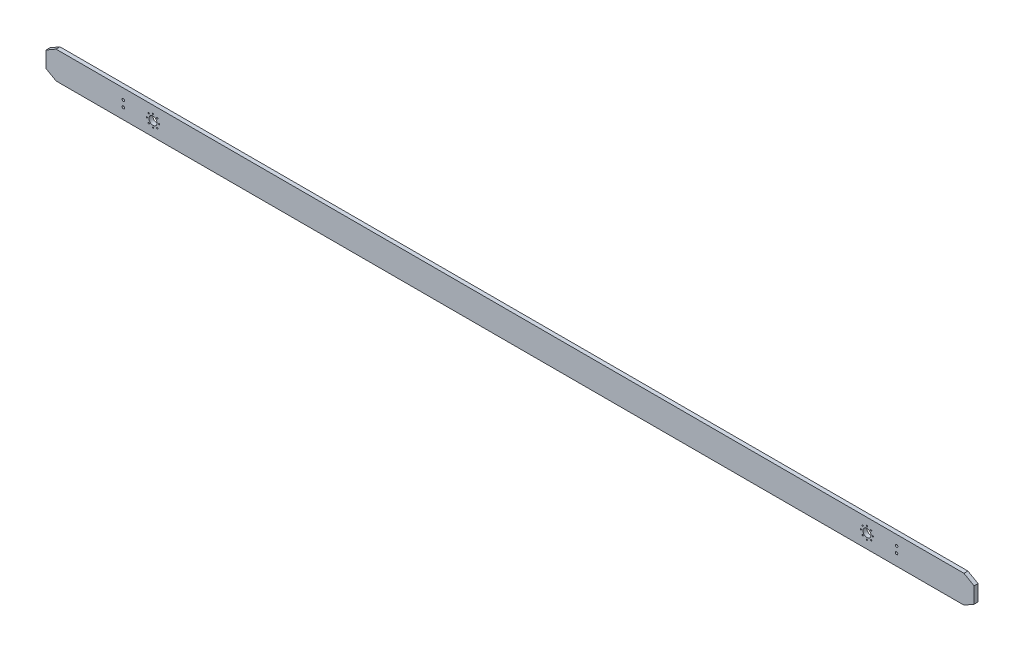
ISO-10303-21;
HEADER;
FILE_DESCRIPTION(('STEP AP214'),'2;1');
FILE_NAME('part.step','',(''),(''),'','','');
FILE_SCHEMA(('AUTOMOTIVE_DESIGN { 1 0 10303 214 1 1 1 1 }'));
ENDSEC;
DATA;
#1=APPLICATION_CONTEXT('core data for automotive mechanical design processes');
#2=APPLICATION_PROTOCOL_DEFINITION('international standard','automotive_design',2000,#1);
#3=PRODUCT_CONTEXT('',#1,'mechanical');
#4=PRODUCT('Part','Part','',(#3));
#5=PRODUCT_RELATED_PRODUCT_CATEGORY('part','',(#4));
#6=PRODUCT_DEFINITION_FORMATION('','',#4);
#7=PRODUCT_DEFINITION_CONTEXT('part definition',#1,'design');
#8=PRODUCT_DEFINITION('design','',#6,#7);
#9=PRODUCT_DEFINITION_SHAPE('','',#8);
#10=(LENGTH_UNIT() NAMED_UNIT(*) SI_UNIT(.MILLI.,.METRE.));
#11=(NAMED_UNIT(*) PLANE_ANGLE_UNIT() SI_UNIT($,.RADIAN.));
#12=(NAMED_UNIT(*) SI_UNIT($,.STERADIAN.) SOLID_ANGLE_UNIT());
#13=UNCERTAINTY_MEASURE_WITH_UNIT(LENGTH_MEASURE(1.E-05),#10,'distance_accuracy_value','');
#14=(GEOMETRIC_REPRESENTATION_CONTEXT(3) GLOBAL_UNCERTAINTY_ASSIGNED_CONTEXT((#13)) GLOBAL_UNIT_ASSIGNED_CONTEXT((#10,
#11,#12)) REPRESENTATION_CONTEXT('',''));
#15=CARTESIAN_POINT('',(0.,0.,0.));
#16=DIRECTION('',(0.,0.,1.));
#17=DIRECTION('',(1.,0.,0.));
#18=AXIS2_PLACEMENT_3D('',#15,#16,#17);
#19=CARTESIAN_POINT('',(55.650662,-30.499967,-0.79));
#20=DIRECTION('',(0.,0.,1.));
#21=DIRECTION('',(1.,0.,0.));
#22=AXIS2_PLACEMENT_3D('',#19,#20,#21);
#23=CYLINDRICAL_SURFACE('',#22,0.25);
#24=DIRECTION('',(0.,0.,1.));
#25=VECTOR('',#24,1.);
#26=CARTESIAN_POINT('',(55.900662,-30.499967,-0.79));
#27=LINE('',#26,#25);
#28=CARTESIAN_POINT('',(55.900662,-30.499967,0.));
#29=VERTEX_POINT('',#28);
#30=CARTESIAN_POINT('',(55.900662,-30.499967,1.58));
#31=VERTEX_POINT('',#30);
#32=EDGE_CURVE('E10',#29,#31,#27,.T.);
#33=ORIENTED_EDGE('',*,*,#32,.F.);
#34=CARTESIAN_POINT('',(55.650662,-30.499967,0.));
#35=DIRECTION('',(0.,0.,1.));
#36=DIRECTION('',(1.,0.,0.));
#37=AXIS2_PLACEMENT_3D('',#34,#35,#36);
#38=CIRCLE('',#37,0.25);
#39=EDGE_CURVE('E290',#29,#29,#38,.T.);
#40=ORIENTED_EDGE('',*,*,#39,.F.);
#41=ORIENTED_EDGE('',*,*,#32,.T.);
#42=CARTESIAN_POINT('',(55.650662,-30.499967,1.58));
#43=DIRECTION('',(0.,0.,1.));
#44=DIRECTION('',(1.,0.,0.));
#45=AXIS2_PLACEMENT_3D('',#42,#43,#44);
#46=CIRCLE('',#45,0.25);
#47=EDGE_CURVE('E371',#31,#31,#46,.T.);
#48=ORIENTED_EDGE('',*,*,#47,.T.);
#49=EDGE_LOOP('',(#33,#40,#41,#48));
#50=FACE_BOUND('',#49,.T.);
#51=ADVANCED_FACE('F16',(#50),#23,.F.);
#52=CARTESIAN_POINT('',(53.953606,-31.202911,-0.79));
#53=DIRECTION('',(0.,0.,1.));
#54=DIRECTION('',(1.,0.,0.));
#55=AXIS2_PLACEMENT_3D('',#52,#53,#54);
#56=CYLINDRICAL_SURFACE('',#55,0.25);
#57=DIRECTION('',(0.,0.,1.));
#58=VECTOR('',#57,1.);
#59=CARTESIAN_POINT('',(54.203606,-31.202911,-0.79));
#60=LINE('',#59,#58);
#61=CARTESIAN_POINT('',(54.203606,-31.202911,0.));
#62=VERTEX_POINT('',#61);
#63=CARTESIAN_POINT('',(54.203606,-31.202911,1.58));
#64=VERTEX_POINT('',#63);
#65=EDGE_CURVE('E27',#62,#64,#60,.T.);
#66=ORIENTED_EDGE('',*,*,#65,.F.);
#67=CARTESIAN_POINT('',(53.953606,-31.202911,0.));
#68=DIRECTION('',(0.,0.,1.));
#69=DIRECTION('',(1.,0.,0.));
#70=AXIS2_PLACEMENT_3D('',#67,#68,#69);
#71=CIRCLE('',#70,0.25);
#72=EDGE_CURVE('E289',#62,#62,#71,.T.);
#73=ORIENTED_EDGE('',*,*,#72,.F.);
#74=ORIENTED_EDGE('',*,*,#65,.T.);
#75=CARTESIAN_POINT('',(53.953606,-31.202911,1.58));
#76=DIRECTION('',(0.,0.,1.));
#77=DIRECTION('',(1.,0.,0.));
#78=AXIS2_PLACEMENT_3D('',#75,#76,#77);
#79=CIRCLE('',#78,0.25);
#80=EDGE_CURVE('E369',#64,#64,#79,.T.);
#81=ORIENTED_EDGE('',*,*,#80,.T.);
#82=EDGE_LOOP('',(#66,#73,#74,#81));
#83=FACE_BOUND('',#82,.T.);
#84=ADVANCED_FACE('F18',(#83),#56,.F.);
#85=CARTESIAN_POINT('',(57.347718,-31.202911,-0.79));
#86=DIRECTION('',(0.,0.,1.));
#87=DIRECTION('',(1.,0.,0.));
#88=AXIS2_PLACEMENT_3D('',#85,#86,#87);
#89=CYLINDRICAL_SURFACE('',#88,0.25);
#90=DIRECTION('',(0.,0.,1.));
#91=VECTOR('',#90,1.);
#92=CARTESIAN_POINT('',(57.597718,-31.202911,-0.79));
#93=LINE('',#92,#91);
#94=CARTESIAN_POINT('',(57.597718,-31.202911,0.));
#95=VERTEX_POINT('',#94);
#96=CARTESIAN_POINT('',(57.597718,-31.202911,1.58));
#97=VERTEX_POINT('',#96);
#98=EDGE_CURVE('E220',#95,#97,#93,.T.);
#99=ORIENTED_EDGE('',*,*,#98,.F.);
#100=CARTESIAN_POINT('',(57.347718,-31.202911,0.));
#101=DIRECTION('',(0.,0.,1.));
#102=DIRECTION('',(1.,0.,0.));
#103=AXIS2_PLACEMENT_3D('',#100,#101,#102);
#104=CIRCLE('',#103,0.25);
#105=EDGE_CURVE('E225',#95,#95,#104,.T.);
#106=ORIENTED_EDGE('',*,*,#105,.F.);
#107=ORIENTED_EDGE('',*,*,#98,.T.);
#108=CARTESIAN_POINT('',(57.347718,-31.202911,1.58));
#109=DIRECTION('',(0.,0.,1.));
#110=DIRECTION('',(1.,0.,0.));
#111=AXIS2_PLACEMENT_3D('',#108,#109,#110);
#112=CIRCLE('',#111,0.25);
#113=EDGE_CURVE('E223',#97,#97,#112,.T.);
#114=ORIENTED_EDGE('',*,*,#113,.T.);
#115=EDGE_LOOP('',(#99,#106,#107,#114));
#116=FACE_BOUND('',#115,.T.);
#117=ADVANCED_FACE('F221',(#116),#89,.F.);
#118=CARTESIAN_POINT('',(43.849802,-31.649967,-0.79));
#119=DIRECTION('',(0.,0.,1.));
#120=DIRECTION('',(1.,0.,0.));
#121=AXIS2_PLACEMENT_3D('',#118,#119,#120);
#122=CYLINDRICAL_SURFACE('',#121,0.5);
#123=DIRECTION('',(0.,0.,1.));
#124=VECTOR('',#123,1.);
#125=CARTESIAN_POINT('',(44.349802,-31.649967,-0.79));
#126=LINE('',#125,#124);
#127=CARTESIAN_POINT('',(44.349802,-31.649967,0.));
#128=VERTEX_POINT('',#127);
#129=CARTESIAN_POINT('',(44.349802,-31.649967,1.58));
#130=VERTEX_POINT('',#129);
#131=EDGE_CURVE('E20',#128,#130,#126,.T.);
#132=ORIENTED_EDGE('',*,*,#131,.F.);
#133=CARTESIAN_POINT('',(43.849802,-31.649967,0.));
#134=DIRECTION('',(0.,0.,1.));
#135=DIRECTION('',(1.,0.,0.));
#136=AXIS2_PLACEMENT_3D('',#133,#134,#135);
#137=CIRCLE('',#136,0.5);
#138=EDGE_CURVE('E283',#128,#128,#137,.T.);
#139=ORIENTED_EDGE('',*,*,#138,.F.);
#140=ORIENTED_EDGE('',*,*,#131,.T.);
#141=CARTESIAN_POINT('',(43.849802,-31.649967,1.58));
#142=DIRECTION('',(0.,0.,1.));
#143=DIRECTION('',(1.,0.,0.));
#144=AXIS2_PLACEMENT_3D('',#141,#142,#143);
#145=CIRCLE('',#144,0.5);
#146=EDGE_CURVE('E370',#130,#130,#145,.T.);
#147=ORIENTED_EDGE('',*,*,#146,.T.);
#148=EDGE_LOOP('',(#132,#139,#140,#147));
#149=FACE_BOUND('',#148,.T.);
#150=ADVANCED_FACE('F765',(#149),#122,.F.);
#151=CARTESIAN_POINT('',(53.250662,-32.899967,-0.79));
#152=DIRECTION('',(0.,0.,1.));
#153=DIRECTION('',(1.,0.,0.));
#154=AXIS2_PLACEMENT_3D('',#151,#152,#153);
#155=CYLINDRICAL_SURFACE('',#154,0.25);
#156=DIRECTION('',(0.,0.,1.));
#157=VECTOR('',#156,1.);
#158=CARTESIAN_POINT('',(53.500662,-32.899967,-0.79));
#159=LINE('',#158,#157);
#160=CARTESIAN_POINT('',(53.500662,-32.899967,0.));
#161=VERTEX_POINT('',#160);
#162=CARTESIAN_POINT('',(53.500662,-32.899967,1.58));
#163=VERTEX_POINT('',#162);
#164=EDGE_CURVE('E233',#161,#163,#159,.T.);
#165=ORIENTED_EDGE('',*,*,#164,.F.);
#166=CARTESIAN_POINT('',(53.250662,-32.899967,0.));
#167=DIRECTION('',(0.,0.,1.));
#168=DIRECTION('',(1.,0.,0.));
#169=AXIS2_PLACEMENT_3D('',#166,#167,#168);
#170=CIRCLE('',#169,0.25);
#171=EDGE_CURVE('E282',#161,#161,#170,.T.);
#172=ORIENTED_EDGE('',*,*,#171,.F.);
#173=ORIENTED_EDGE('',*,*,#164,.T.);
#174=CARTESIAN_POINT('',(53.250662,-32.899967,1.58));
#175=DIRECTION('',(0.,0.,1.));
#176=DIRECTION('',(1.,0.,0.));
#177=AXIS2_PLACEMENT_3D('',#174,#175,#176);
#178=CIRCLE('',#177,0.25);
#179=EDGE_CURVE('E365',#163,#163,#178,.T.);
#180=ORIENTED_EDGE('',*,*,#179,.T.);
#181=EDGE_LOOP('',(#165,#172,#173,#180));
#182=FACE_BOUND('',#181,.T.);
#183=ADVANCED_FACE('F771',(#182),#155,.F.);
#184=CARTESIAN_POINT('',(55.650662,-32.899967,-0.79));
#185=DIRECTION('',(0.,0.,1.));
#186=DIRECTION('',(1.,0.,0.));
#187=AXIS2_PLACEMENT_3D('',#184,#185,#186);
#188=CYLINDRICAL_SURFACE('',#187,1.6);
#189=DIRECTION('',(0.,0.,1.));
#190=VECTOR('',#189,1.);
#191=CARTESIAN_POINT('',(57.250662,-32.899967,-0.79));
#192=LINE('',#191,#190);
#193=CARTESIAN_POINT('',(57.250662,-32.899967,0.));
#194=VERTEX_POINT('',#193);
#195=CARTESIAN_POINT('',(57.250662,-32.899967,1.58));
#196=VERTEX_POINT('',#195);
#197=EDGE_CURVE('E414',#194,#196,#192,.T.);
#198=ORIENTED_EDGE('',*,*,#197,.F.);
#199=CARTESIAN_POINT('',(55.650662,-32.899967,0.));
#200=DIRECTION('',(0.,0.,1.));
#201=DIRECTION('',(1.,0.,0.));
#202=AXIS2_PLACEMENT_3D('',#199,#200,#201);
#203=CIRCLE('',#202,1.6);
#204=EDGE_CURVE('E266',#194,#194,#203,.T.);
#205=ORIENTED_EDGE('',*,*,#204,.F.);
#206=ORIENTED_EDGE('',*,*,#197,.T.);
#207=CARTESIAN_POINT('',(55.650662,-32.899967,1.58));
#208=DIRECTION('',(0.,0.,1.));
#209=DIRECTION('',(1.,0.,0.));
#210=AXIS2_PLACEMENT_3D('',#207,#208,#209);
#211=CIRCLE('',#210,1.6);
#212=EDGE_CURVE('E361',#196,#196,#211,.T.);
#213=ORIENTED_EDGE('',*,*,#212,.T.);
#214=EDGE_LOOP('',(#198,#205,#206,#213));
#215=FACE_BOUND('',#214,.T.);
#216=ADVANCED_FACE('F779',(#215),#188,.F.);
#217=CARTESIAN_POINT('',(58.050662,-32.899967,-0.79));
#218=DIRECTION('',(0.,0.,1.));
#219=DIRECTION('',(1.,0.,0.));
#220=AXIS2_PLACEMENT_3D('',#217,#218,#219);
#221=CYLINDRICAL_SURFACE('',#220,0.25);
#222=DIRECTION('',(0.,0.,1.));
#223=VECTOR('',#222,1.);
#224=CARTESIAN_POINT('',(58.300662,-32.899967,-0.79));
#225=LINE('',#224,#223);
#226=CARTESIAN_POINT('',(58.300662,-32.899967,0.));
#227=VERTEX_POINT('',#226);
#228=CARTESIAN_POINT('',(58.300662,-32.899967,1.58));
#229=VERTEX_POINT('',#228);
#230=EDGE_CURVE('E256',#227,#229,#225,.T.);
#231=ORIENTED_EDGE('',*,*,#230,.F.);
#232=CARTESIAN_POINT('',(58.050662,-32.899967,0.));
#233=DIRECTION('',(0.,0.,1.));
#234=DIRECTION('',(1.,0.,0.));
#235=AXIS2_PLACEMENT_3D('',#232,#233,#234);
#236=CIRCLE('',#235,0.25);
#237=EDGE_CURVE('E262',#227,#227,#236,.T.);
#238=ORIENTED_EDGE('',*,*,#237,.F.);
#239=ORIENTED_EDGE('',*,*,#230,.T.);
#240=CARTESIAN_POINT('',(58.050662,-32.899967,1.58));
#241=DIRECTION('',(0.,0.,1.));
#242=DIRECTION('',(1.,0.,0.));
#243=AXIS2_PLACEMENT_3D('',#240,#241,#242);
#244=CIRCLE('',#243,0.25);
#245=EDGE_CURVE('E366',#229,#229,#244,.T.);
#246=ORIENTED_EDGE('',*,*,#245,.T.);
#247=EDGE_LOOP('',(#231,#238,#239,#246));
#248=FACE_BOUND('',#247,.T.);
#249=ADVANCED_FACE('F787',(#248),#221,.F.);
#250=CARTESIAN_POINT('',(340.298918,-30.499967,-0.79));
#251=DIRECTION('',(0.,0.,1.));
#252=DIRECTION('',(1.,0.,0.));
#253=AXIS2_PLACEMENT_3D('',#250,#251,#252);
#254=CYLINDRICAL_SURFACE('',#253,0.25);
#255=DIRECTION('',(0.,0.,1.));
#256=VECTOR('',#255,1.);
#257=CARTESIAN_POINT('',(340.548918,-30.499967,-0.79));
#258=LINE('',#257,#256);
#259=CARTESIAN_POINT('',(340.548918,-30.499967,0.));
#260=VERTEX_POINT('',#259);
#261=CARTESIAN_POINT('',(340.548918,-30.499967,1.58));
#262=VERTEX_POINT('',#261);
#263=EDGE_CURVE('E253',#260,#262,#258,.T.);
#264=ORIENTED_EDGE('',*,*,#263,.F.);
#265=CARTESIAN_POINT('',(340.298918,-30.499967,0.));
#266=DIRECTION('',(0.,0.,1.));
#267=DIRECTION('',(1.,0.,0.));
#268=AXIS2_PLACEMENT_3D('',#265,#266,#267);
#269=CIRCLE('',#268,0.25);
#270=EDGE_CURVE('E267',#260,#260,#269,.T.);
#271=ORIENTED_EDGE('',*,*,#270,.F.);
#272=ORIENTED_EDGE('',*,*,#263,.T.);
#273=CARTESIAN_POINT('',(340.298918,-30.499967,1.58));
#274=DIRECTION('',(0.,0.,1.));
#275=DIRECTION('',(1.,0.,0.));
#276=AXIS2_PLACEMENT_3D('',#273,#274,#275);
#277=CIRCLE('',#276,0.25);
#278=EDGE_CURVE('E360',#262,#262,#277,.T.);
#279=ORIENTED_EDGE('',*,*,#278,.T.);
#280=EDGE_LOOP('',(#264,#271,#272,#279));
#281=FACE_BOUND('',#280,.T.);
#282=ADVANCED_FACE('F646',(#281),#254,.F.);
#283=CARTESIAN_POINT('',(338.601862,-31.202911,-0.79));
#284=DIRECTION('',(0.,0.,1.));
#285=DIRECTION('',(1.,0.,0.));
#286=AXIS2_PLACEMENT_3D('',#283,#284,#285);
#287=CYLINDRICAL_SURFACE('',#286,0.25);
#288=DIRECTION('',(0.,0.,1.));
#289=VECTOR('',#288,1.);
#290=CARTESIAN_POINT('',(338.851862,-31.202911,-0.79));
#291=LINE('',#290,#289);
#292=CARTESIAN_POINT('',(338.851862,-31.202911,0.));
#293=VERTEX_POINT('',#292);
#294=CARTESIAN_POINT('',(338.851862,-31.202911,1.58));
#295=VERTEX_POINT('',#294);
#296=EDGE_CURVE('E257',#293,#295,#291,.T.);
#297=ORIENTED_EDGE('',*,*,#296,.F.);
#298=CARTESIAN_POINT('',(338.601862,-31.202911,0.));
#299=DIRECTION('',(0.,0.,1.));
#300=DIRECTION('',(1.,0.,0.));
#301=AXIS2_PLACEMENT_3D('',#298,#299,#300);
#302=CIRCLE('',#301,0.25);
#303=EDGE_CURVE('E271',#293,#293,#302,.T.);
#304=ORIENTED_EDGE('',*,*,#303,.F.);
#305=ORIENTED_EDGE('',*,*,#296,.T.);
#306=CARTESIAN_POINT('',(338.601862,-31.202911,1.58));
#307=DIRECTION('',(0.,0.,1.));
#308=DIRECTION('',(1.,0.,0.));
#309=AXIS2_PLACEMENT_3D('',#306,#307,#308);
#310=CIRCLE('',#309,0.25);
#311=EDGE_CURVE('E351',#295,#295,#310,.T.);
#312=ORIENTED_EDGE('',*,*,#311,.T.);
#313=EDGE_LOOP('',(#297,#304,#305,#312));
#314=FACE_BOUND('',#313,.T.);
#315=ADVANCED_FACE('F803',(#314),#287,.F.);
#316=CARTESIAN_POINT('',(341.995974,-31.202911,-0.79));
#317=DIRECTION('',(0.,0.,1.));
#318=DIRECTION('',(1.,0.,0.));
#319=AXIS2_PLACEMENT_3D('',#316,#317,#318);
#320=CYLINDRICAL_SURFACE('',#319,0.25);
#321=DIRECTION('',(0.,0.,1.));
#322=VECTOR('',#321,1.);
#323=CARTESIAN_POINT('',(342.245974,-31.202911,-0.79));
#324=LINE('',#323,#322);
#325=CARTESIAN_POINT('',(342.245974,-31.202911,0.));
#326=VERTEX_POINT('',#325);
#327=CARTESIAN_POINT('',(342.245974,-31.202911,1.58));
#328=VERTEX_POINT('',#327);
#329=EDGE_CURVE('E407',#326,#328,#324,.T.);
#330=ORIENTED_EDGE('',*,*,#329,.F.);
#331=CARTESIAN_POINT('',(341.995974,-31.202911,0.));
#332=DIRECTION('',(0.,0.,1.));
#333=DIRECTION('',(1.,0.,0.));
#334=AXIS2_PLACEMENT_3D('',#331,#332,#333);
#335=CIRCLE('',#334,0.25);
#336=EDGE_CURVE('E272',#326,#326,#335,.T.);
#337=ORIENTED_EDGE('',*,*,#336,.F.);
#338=ORIENTED_EDGE('',*,*,#329,.T.);
#339=CARTESIAN_POINT('',(341.995974,-31.202911,1.58));
#340=DIRECTION('',(0.,0.,1.));
#341=DIRECTION('',(1.,0.,0.));
#342=AXIS2_PLACEMENT_3D('',#339,#340,#341);
#343=CIRCLE('',#342,0.25);
#344=EDGE_CURVE('E347',#328,#328,#343,.T.);
#345=ORIENTED_EDGE('',*,*,#344,.T.);
#346=EDGE_LOOP('',(#330,#337,#338,#345));
#347=FACE_BOUND('',#346,.T.);
#348=ADVANCED_FACE('F718',(#347),#320,.F.);
#349=CARTESIAN_POINT('',(352.099802,-31.459967,-0.79));
#350=DIRECTION('',(0.,0.,1.));
#351=DIRECTION('',(1.,0.,0.));
#352=AXIS2_PLACEMENT_3D('',#349,#350,#351);
#353=CYLINDRICAL_SURFACE('',#352,0.5);
#354=DIRECTION('',(0.,0.,1.));
#355=VECTOR('',#354,1.);
#356=CARTESIAN_POINT('',(352.599802,-31.459967,-0.79));
#357=LINE('',#356,#355);
#358=CARTESIAN_POINT('',(352.599802,-31.459967,0.));
#359=VERTEX_POINT('',#358);
#360=CARTESIAN_POINT('',(352.599802,-31.459967,1.58));
#361=VERTEX_POINT('',#360);
#362=EDGE_CURVE('E402',#359,#361,#357,.T.);
#363=ORIENTED_EDGE('',*,*,#362,.F.);
#364=CARTESIAN_POINT('',(352.099802,-31.459967,0.));
#365=DIRECTION('',(0.,0.,1.));
#366=DIRECTION('',(1.,0.,0.));
#367=AXIS2_PLACEMENT_3D('',#364,#365,#366);
#368=CIRCLE('',#367,0.5);
#369=EDGE_CURVE('E261',#359,#359,#368,.T.);
#370=ORIENTED_EDGE('',*,*,#369,.F.);
#371=ORIENTED_EDGE('',*,*,#362,.T.);
#372=CARTESIAN_POINT('',(352.099802,-31.459967,1.58));
#373=DIRECTION('',(0.,0.,1.));
#374=DIRECTION('',(1.,0.,0.));
#375=AXIS2_PLACEMENT_3D('',#372,#373,#374);
#376=CIRCLE('',#375,0.5);
#377=EDGE_CURVE('E343',#361,#361,#376,.T.);
#378=ORIENTED_EDGE('',*,*,#377,.T.);
#379=EDGE_LOOP('',(#363,#370,#371,#378));
#380=FACE_BOUND('',#379,.T.);
#381=ADVANCED_FACE('F714',(#380),#353,.F.);
#382=CARTESIAN_POINT('',(337.898918,-32.899967,-0.79));
#383=DIRECTION('',(0.,0.,1.));
#384=DIRECTION('',(1.,0.,0.));
#385=AXIS2_PLACEMENT_3D('',#382,#383,#384);
#386=CYLINDRICAL_SURFACE('',#385,0.25);
#387=DIRECTION('',(0.,0.,1.));
#388=VECTOR('',#387,1.);
#389=CARTESIAN_POINT('',(338.148918,-32.899967,-0.79));
#390=LINE('',#389,#388);
#391=CARTESIAN_POINT('',(338.148918,-32.899967,0.));
#392=VERTEX_POINT('',#391);
#393=CARTESIAN_POINT('',(338.148918,-32.899967,1.58));
#394=VERTEX_POINT('',#393);
#395=EDGE_CURVE('E399',#392,#394,#390,.T.);
#396=ORIENTED_EDGE('',*,*,#395,.F.);
#397=CARTESIAN_POINT('',(337.898918,-32.899967,0.));
#398=DIRECTION('',(0.,0.,1.));
#399=DIRECTION('',(1.,0.,0.));
#400=AXIS2_PLACEMENT_3D('',#397,#398,#399);
#401=CIRCLE('',#400,0.25);
#402=EDGE_CURVE('E251',#392,#392,#401,.T.);
#403=ORIENTED_EDGE('',*,*,#402,.F.);
#404=ORIENTED_EDGE('',*,*,#395,.T.);
#405=CARTESIAN_POINT('',(337.898918,-32.899967,1.58));
#406=DIRECTION('',(0.,0.,1.));
#407=DIRECTION('',(1.,0.,0.));
#408=AXIS2_PLACEMENT_3D('',#405,#406,#407);
#409=CIRCLE('',#408,0.25);
#410=EDGE_CURVE('E338',#394,#394,#409,.T.);
#411=ORIENTED_EDGE('',*,*,#410,.T.);
#412=EDGE_LOOP('',(#396,#403,#404,#411));
#413=FACE_BOUND('',#412,.T.);
#414=ADVANCED_FACE('F717',(#413),#386,.F.);
#415=CARTESIAN_POINT('',(340.298918,-32.899967,-0.79));
#416=DIRECTION('',(0.,0.,1.));
#417=DIRECTION('',(1.,0.,0.));
#418=AXIS2_PLACEMENT_3D('',#415,#416,#417);
#419=CYLINDRICAL_SURFACE('',#418,1.6);
#420=DIRECTION('',(0.,0.,1.));
#421=VECTOR('',#420,1.);
#422=CARTESIAN_POINT('',(341.898918,-32.899967,-0.79));
#423=LINE('',#422,#421);
#424=CARTESIAN_POINT('',(341.898918,-32.899967,0.));
#425=VERTEX_POINT('',#424);
#426=CARTESIAN_POINT('',(341.898918,-32.899967,1.58));
#427=VERTEX_POINT('',#426);
#428=EDGE_CURVE('E397',#425,#427,#423,.T.);
#429=ORIENTED_EDGE('',*,*,#428,.F.);
#430=CARTESIAN_POINT('',(340.298918,-32.899967,0.));
#431=DIRECTION('',(0.,0.,1.));
#432=DIRECTION('',(1.,0.,0.));
#433=AXIS2_PLACEMENT_3D('',#430,#431,#432);
#434=CIRCLE('',#433,1.6);
#435=EDGE_CURVE('E239',#425,#425,#434,.T.);
#436=ORIENTED_EDGE('',*,*,#435,.F.);
#437=ORIENTED_EDGE('',*,*,#428,.T.);
#438=CARTESIAN_POINT('',(340.298918,-32.899967,1.58));
#439=DIRECTION('',(0.,0.,1.));
#440=DIRECTION('',(1.,0.,0.));
#441=AXIS2_PLACEMENT_3D('',#438,#439,#440);
#442=CIRCLE('',#441,1.6);
#443=EDGE_CURVE('E334',#427,#427,#442,.T.);
#444=ORIENTED_EDGE('',*,*,#443,.T.);
#445=EDGE_LOOP('',(#429,#436,#437,#444));
#446=FACE_BOUND('',#445,.T.);
#447=ADVANCED_FACE('F832',(#446),#419,.F.);
#448=CARTESIAN_POINT('',(342.698918,-32.899967,-0.79));
#449=DIRECTION('',(0.,0.,1.));
#450=DIRECTION('',(1.,0.,0.));
#451=AXIS2_PLACEMENT_3D('',#448,#449,#450);
#452=CYLINDRICAL_SURFACE('',#451,0.25);
#453=DIRECTION('',(0.,0.,1.));
#454=VECTOR('',#453,1.);
#455=CARTESIAN_POINT('',(342.948918,-32.899967,-0.79));
#456=LINE('',#455,#454);
#457=CARTESIAN_POINT('',(342.948918,-32.899967,0.));
#458=VERTEX_POINT('',#457);
#459=CARTESIAN_POINT('',(342.948918,-32.899967,1.58));
#460=VERTEX_POINT('',#459);
#461=EDGE_CURVE('E394',#458,#460,#456,.T.);
#462=ORIENTED_EDGE('',*,*,#461,.F.);
#463=CARTESIAN_POINT('',(342.698918,-32.899967,0.));
#464=DIRECTION('',(0.,0.,1.));
#465=DIRECTION('',(1.,0.,0.));
#466=AXIS2_PLACEMENT_3D('',#463,#464,#465);
#467=CIRCLE('',#466,0.25);
#468=EDGE_CURVE('E236',#458,#458,#467,.T.);
#469=ORIENTED_EDGE('',*,*,#468,.F.);
#470=ORIENTED_EDGE('',*,*,#461,.T.);
#471=CARTESIAN_POINT('',(342.698918,-32.899967,1.58));
#472=DIRECTION('',(0.,0.,1.));
#473=DIRECTION('',(1.,0.,0.));
#474=AXIS2_PLACEMENT_3D('',#471,#472,#473);
#475=CIRCLE('',#474,0.25);
#476=EDGE_CURVE('E339',#460,#460,#475,.T.);
#477=ORIENTED_EDGE('',*,*,#476,.T.);
#478=EDGE_LOOP('',(#462,#469,#470,#477));
#479=FACE_BOUND('',#478,.T.);
#480=ADVANCED_FACE('F841',(#479),#452,.F.);
#481=CARTESIAN_POINT('',(43.849802,-34.189967,-0.79));
#482=DIRECTION('',(0.,0.,1.));
#483=DIRECTION('',(1.,0.,0.));
#484=AXIS2_PLACEMENT_3D('',#481,#482,#483);
#485=CYLINDRICAL_SURFACE('',#484,0.5);
#486=DIRECTION('',(0.,0.,1.));
#487=VECTOR('',#486,1.);
#488=CARTESIAN_POINT('',(44.349802,-34.189967,-0.79));
#489=LINE('',#488,#487);
#490=CARTESIAN_POINT('',(44.349802,-34.189967,0.));
#491=VERTEX_POINT('',#490);
#492=CARTESIAN_POINT('',(44.349802,-34.189967,1.58));
#493=VERTEX_POINT('',#492);
#494=EDGE_CURVE('E398',#491,#493,#489,.T.);
#495=ORIENTED_EDGE('',*,*,#494,.F.);
#496=CARTESIAN_POINT('',(43.849802,-34.189967,0.));
#497=DIRECTION('',(0.,0.,1.));
#498=DIRECTION('',(1.,0.,0.));
#499=AXIS2_PLACEMENT_3D('',#496,#497,#498);
#500=CIRCLE('',#499,0.5);
#501=EDGE_CURVE('E240',#491,#491,#500,.T.);
#502=ORIENTED_EDGE('',*,*,#501,.F.);
#503=ORIENTED_EDGE('',*,*,#494,.T.);
#504=CARTESIAN_POINT('',(43.849802,-34.189967,1.58));
#505=DIRECTION('',(0.,0.,1.));
#506=DIRECTION('',(1.,0.,0.));
#507=AXIS2_PLACEMENT_3D('',#504,#505,#506);
#508=CIRCLE('',#507,0.5);
#509=EDGE_CURVE('E333',#493,#493,#508,.T.);
#510=ORIENTED_EDGE('',*,*,#509,.T.);
#511=EDGE_LOOP('',(#495,#502,#503,#510));
#512=FACE_BOUND('',#511,.T.);
#513=ADVANCED_FACE('F706',(#512),#485,.F.);
#514=CARTESIAN_POINT('',(53.953606,-34.597023,-0.79));
#515=DIRECTION('',(0.,0.,1.));
#516=DIRECTION('',(1.,0.,0.));
#517=AXIS2_PLACEMENT_3D('',#514,#515,#516);
#518=CYLINDRICAL_SURFACE('',#517,0.25);
#519=DIRECTION('',(0.,0.,1.));
#520=VECTOR('',#519,1.);
#521=CARTESIAN_POINT('',(54.203606,-34.597023,-0.79));
#522=LINE('',#521,#520);
#523=CARTESIAN_POINT('',(54.203606,-34.597023,0.));
#524=VERTEX_POINT('',#523);
#525=CARTESIAN_POINT('',(54.203606,-34.597023,1.58));
#526=VERTEX_POINT('',#525);
#527=EDGE_CURVE('E439',#524,#526,#522,.T.);
#528=ORIENTED_EDGE('',*,*,#527,.F.);
#529=CARTESIAN_POINT('',(53.953606,-34.597023,0.));
#530=DIRECTION('',(0.,0.,1.));
#531=DIRECTION('',(1.,0.,0.));
#532=AXIS2_PLACEMENT_3D('',#529,#530,#531);
#533=CIRCLE('',#532,0.25);
#534=EDGE_CURVE('E241',#524,#524,#533,.T.);
#535=ORIENTED_EDGE('',*,*,#534,.F.);
#536=ORIENTED_EDGE('',*,*,#527,.T.);
#537=CARTESIAN_POINT('',(53.953606,-34.597023,1.58));
#538=DIRECTION('',(0.,0.,1.));
#539=DIRECTION('',(1.,0.,0.));
#540=AXIS2_PLACEMENT_3D('',#537,#538,#539);
#541=CIRCLE('',#540,0.25);
#542=EDGE_CURVE('E329',#526,#526,#541,.T.);
#543=ORIENTED_EDGE('',*,*,#542,.T.);
#544=EDGE_LOOP('',(#528,#535,#536,#543));
#545=FACE_BOUND('',#544,.T.);
#546=ADVANCED_FACE('F704',(#545),#518,.F.);
#547=CARTESIAN_POINT('',(57.347718,-34.597023,-0.79));
#548=DIRECTION('',(0.,0.,1.));
#549=DIRECTION('',(1.,0.,0.));
#550=AXIS2_PLACEMENT_3D('',#547,#548,#549);
#551=CYLINDRICAL_SURFACE('',#550,0.25);
#552=DIRECTION('',(0.,0.,1.));
#553=VECTOR('',#552,1.);
#554=CARTESIAN_POINT('',(57.597718,-34.597023,-0.79));
#555=LINE('',#554,#553);
#556=CARTESIAN_POINT('',(57.597718,-34.597023,0.));
#557=VERTEX_POINT('',#556);
#558=CARTESIAN_POINT('',(57.597718,-34.597023,1.58));
#559=VERTEX_POINT('',#558);
#560=EDGE_CURVE('E393',#557,#559,#555,.T.);
#561=ORIENTED_EDGE('',*,*,#560,.F.);
#562=CARTESIAN_POINT('',(57.347718,-34.597023,0.));
#563=DIRECTION('',(0.,0.,1.));
#564=DIRECTION('',(1.,0.,0.));
#565=AXIS2_PLACEMENT_3D('',#562,#563,#564);
#566=CIRCLE('',#565,0.25);
#567=EDGE_CURVE('E245',#557,#557,#566,.T.);
#568=ORIENTED_EDGE('',*,*,#567,.F.);
#569=ORIENTED_EDGE('',*,*,#560,.T.);
#570=CARTESIAN_POINT('',(57.347718,-34.597023,1.58));
#571=DIRECTION('',(0.,0.,1.));
#572=DIRECTION('',(1.,0.,0.));
#573=AXIS2_PLACEMENT_3D('',#570,#571,#572);
#574=CIRCLE('',#573,0.25);
#575=EDGE_CURVE('E328',#559,#559,#574,.T.);
#576=ORIENTED_EDGE('',*,*,#575,.T.);
#577=EDGE_LOOP('',(#561,#568,#569,#576));
#578=FACE_BOUND('',#577,.T.);
#579=ADVANCED_FACE('F495',(#578),#551,.F.);
#580=CARTESIAN_POINT('',(55.650662,-35.299967,-0.79));
#581=DIRECTION('',(0.,0.,1.));
#582=DIRECTION('',(1.,0.,0.));
#583=AXIS2_PLACEMENT_3D('',#580,#581,#582);
#584=CYLINDRICAL_SURFACE('',#583,0.25);
#585=DIRECTION('',(0.,0.,1.));
#586=VECTOR('',#585,1.);
#587=CARTESIAN_POINT('',(55.900662,-35.299967,-0.79));
#588=LINE('',#587,#586);
#589=CARTESIAN_POINT('',(55.900662,-35.299967,0.));
#590=VERTEX_POINT('',#589);
#591=CARTESIAN_POINT('',(55.900662,-35.299967,1.58));
#592=VERTEX_POINT('',#591);
#593=EDGE_CURVE('E389',#590,#592,#588,.T.);
#594=ORIENTED_EDGE('',*,*,#593,.F.);
#595=CARTESIAN_POINT('',(55.650662,-35.299967,0.));
#596=DIRECTION('',(0.,0.,1.));
#597=DIRECTION('',(1.,0.,0.));
#598=AXIS2_PLACEMENT_3D('',#595,#596,#597);
#599=CIRCLE('',#598,0.25);
#600=EDGE_CURVE('E473',#590,#590,#599,.T.);
#601=ORIENTED_EDGE('',*,*,#600,.F.);
#602=ORIENTED_EDGE('',*,*,#593,.T.);
#603=CARTESIAN_POINT('',(55.650662,-35.299967,1.58));
#604=DIRECTION('',(0.,0.,1.));
#605=DIRECTION('',(1.,0.,0.));
#606=AXIS2_PLACEMENT_3D('',#603,#604,#605);
#607=CIRCLE('',#606,0.25);
#608=EDGE_CURVE('E324',#592,#592,#607,.T.);
#609=ORIENTED_EDGE('',*,*,#608,.T.);
#610=EDGE_LOOP('',(#594,#601,#602,#609));
#611=FACE_BOUND('',#610,.T.);
#612=ADVANCED_FACE('F713',(#611),#584,.F.);
#613=CARTESIAN_POINT('',(352.099802,-33.999967,-0.79));
#614=DIRECTION('',(0.,0.,1.));
#615=DIRECTION('',(1.,0.,0.));
#616=AXIS2_PLACEMENT_3D('',#613,#614,#615);
#617=CYLINDRICAL_SURFACE('',#616,0.5);
#618=DIRECTION('',(0.,0.,1.));
#619=VECTOR('',#618,1.);
#620=CARTESIAN_POINT('',(352.599802,-33.999967,-0.79));
#621=LINE('',#620,#619);
#622=CARTESIAN_POINT('',(352.599802,-33.999967,0.));
#623=VERTEX_POINT('',#622);
#624=CARTESIAN_POINT('',(352.599802,-33.999967,1.58));
#625=VERTEX_POINT('',#624);
#626=EDGE_CURVE('E386',#623,#625,#621,.T.);
#627=ORIENTED_EDGE('',*,*,#626,.F.);
#628=CARTESIAN_POINT('',(352.099802,-33.999967,0.));
#629=DIRECTION('',(0.,0.,1.));
#630=DIRECTION('',(1.,0.,0.));
#631=AXIS2_PLACEMENT_3D('',#628,#629,#630);
#632=CIRCLE('',#631,0.5);
#633=EDGE_CURVE('E469',#623,#623,#632,.T.);
#634=ORIENTED_EDGE('',*,*,#633,.F.);
#635=ORIENTED_EDGE('',*,*,#626,.T.);
#636=CARTESIAN_POINT('',(352.099802,-33.999967,1.58));
#637=DIRECTION('',(0.,0.,1.));
#638=DIRECTION('',(1.,0.,0.));
#639=AXIS2_PLACEMENT_3D('',#636,#637,#638);
#640=CIRCLE('',#639,0.5);
#641=EDGE_CURVE('E320',#625,#625,#640,.T.);
#642=ORIENTED_EDGE('',*,*,#641,.T.);
#643=EDGE_LOOP('',(#627,#634,#635,#642));
#644=FACE_BOUND('',#643,.T.);
#645=ADVANCED_FACE('F709',(#644),#617,.F.);
#646=CARTESIAN_POINT('',(338.601862,-34.597023,-0.79));
#647=DIRECTION('',(0.,0.,1.));
#648=DIRECTION('',(1.,0.,0.));
#649=AXIS2_PLACEMENT_3D('',#646,#647,#648);
#650=CYLINDRICAL_SURFACE('',#649,0.25);
#651=DIRECTION('',(0.,0.,1.));
#652=VECTOR('',#651,1.);
#653=CARTESIAN_POINT('',(338.851862,-34.597023,-0.79));
#654=LINE('',#653,#652);
#655=CARTESIAN_POINT('',(338.851862,-34.597023,0.));
#656=VERTEX_POINT('',#655);
#657=CARTESIAN_POINT('',(338.851862,-34.597023,1.58));
#658=VERTEX_POINT('',#657);
#659=EDGE_CURVE('E390',#656,#658,#654,.T.);
#660=ORIENTED_EDGE('',*,*,#659,.F.);
#661=CARTESIAN_POINT('',(338.601862,-34.597023,0.));
#662=DIRECTION('',(0.,0.,1.));
#663=DIRECTION('',(1.,0.,0.));
#664=AXIS2_PLACEMENT_3D('',#661,#662,#663);
#665=CIRCLE('',#664,0.25);
#666=EDGE_CURVE('E468',#656,#656,#665,.T.);
#667=ORIENTED_EDGE('',*,*,#666,.F.);
#668=ORIENTED_EDGE('',*,*,#659,.T.);
#669=CARTESIAN_POINT('',(338.601862,-34.597023,1.58));
#670=DIRECTION('',(0.,0.,1.));
#671=DIRECTION('',(1.,0.,0.));
#672=AXIS2_PLACEMENT_3D('',#669,#670,#671);
#673=CIRCLE('',#672,0.25);
#674=EDGE_CURVE('E316',#658,#658,#673,.T.);
#675=ORIENTED_EDGE('',*,*,#674,.T.);
#676=EDGE_LOOP('',(#660,#667,#668,#675));
#677=FACE_BOUND('',#676,.T.);
#678=ADVANCED_FACE('F712',(#677),#650,.F.);
#679=CARTESIAN_POINT('',(341.995974,-34.597023,-0.79));
#680=DIRECTION('',(0.,0.,1.));
#681=DIRECTION('',(1.,0.,0.));
#682=AXIS2_PLACEMENT_3D('',#679,#680,#681);
#683=CYLINDRICAL_SURFACE('',#682,0.25);
#684=DIRECTION('',(0.,0.,1.));
#685=VECTOR('',#684,1.);
#686=CARTESIAN_POINT('',(342.245974,-34.597023,-0.79));
#687=LINE('',#686,#685);
#688=CARTESIAN_POINT('',(342.245974,-34.597023,0.));
#689=VERTEX_POINT('',#688);
#690=CARTESIAN_POINT('',(342.245974,-34.597023,1.58));
#691=VERTEX_POINT('',#690);
#692=EDGE_CURVE('E385',#689,#691,#687,.T.);
#693=ORIENTED_EDGE('',*,*,#692,.F.);
#694=CARTESIAN_POINT('',(341.995974,-34.597023,0.));
#695=DIRECTION('',(0.,0.,1.));
#696=DIRECTION('',(1.,0.,0.));
#697=AXIS2_PLACEMENT_3D('',#694,#695,#696);
#698=CIRCLE('',#697,0.25);
#699=EDGE_CURVE('E464',#689,#689,#698,.T.);
#700=ORIENTED_EDGE('',*,*,#699,.F.);
#701=ORIENTED_EDGE('',*,*,#692,.T.);
#702=CARTESIAN_POINT('',(341.995974,-34.597023,1.58));
#703=DIRECTION('',(0.,0.,1.));
#704=DIRECTION('',(1.,0.,0.));
#705=AXIS2_PLACEMENT_3D('',#702,#703,#704);
#706=CIRCLE('',#705,0.25);
#707=EDGE_CURVE('E312',#691,#691,#706,.T.);
#708=ORIENTED_EDGE('',*,*,#707,.T.);
#709=EDGE_LOOP('',(#693,#700,#701,#708));
#710=FACE_BOUND('',#709,.T.);
#711=ADVANCED_FACE('F887',(#710),#683,.F.);
#712=CARTESIAN_POINT('',(340.298918,-35.299967,-0.79));
#713=DIRECTION('',(0.,0.,1.));
#714=DIRECTION('',(1.,0.,0.));
#715=AXIS2_PLACEMENT_3D('',#712,#713,#714);
#716=CYLINDRICAL_SURFACE('',#715,0.25);
#717=DIRECTION('',(0.,0.,1.));
#718=VECTOR('',#717,1.);
#719=CARTESIAN_POINT('',(340.548918,-35.299967,-0.79));
#720=LINE('',#719,#718);
#721=CARTESIAN_POINT('',(340.548918,-35.299967,0.));
#722=VERTEX_POINT('',#721);
#723=CARTESIAN_POINT('',(340.548918,-35.299967,1.58));
#724=VERTEX_POINT('',#723);
#725=EDGE_CURVE('E355',#722,#724,#720,.T.);
#726=ORIENTED_EDGE('',*,*,#725,.F.);
#727=CARTESIAN_POINT('',(340.298918,-35.299967,0.));
#728=DIRECTION('',(0.,0.,1.));
#729=DIRECTION('',(1.,0.,0.));
#730=AXIS2_PLACEMENT_3D('',#727,#728,#729);
#731=CIRCLE('',#730,0.25);
#732=EDGE_CURVE('E460',#722,#722,#731,.T.);
#733=ORIENTED_EDGE('',*,*,#732,.F.);
#734=ORIENTED_EDGE('',*,*,#725,.T.);
#735=CARTESIAN_POINT('',(340.298918,-35.299967,1.58));
#736=DIRECTION('',(0.,0.,1.));
#737=DIRECTION('',(1.,0.,0.));
#738=AXIS2_PLACEMENT_3D('',#735,#736,#737);
#739=CIRCLE('',#738,0.25);
#740=EDGE_CURVE('E308',#724,#724,#739,.T.);
#741=ORIENTED_EDGE('',*,*,#740,.T.);
#742=EDGE_LOOP('',(#726,#733,#734,#741));
#743=FACE_BOUND('',#742,.T.);
#744=ADVANCED_FACE('F680',(#743),#716,.F.);
#745=CARTESIAN_POINT('',(12.999802,-36.179967,0.));
#746=DIRECTION('',(-1.,0.,0.));
#747=DIRECTION('',(0.,0.,1.));
#748=AXIS2_PLACEMENT_3D('',#745,#746,#747);
#749=PLANE('',#748);
#750=DIRECTION('',(0.,0.,1.));
#751=VECTOR('',#750,1.);
#752=CARTESIAN_POINT('',(12.999802,-36.179967,0.));
#753=LINE('',#752,#751);
#754=CARTESIAN_POINT('',(12.999802,-36.179967,0.));
#755=VERTEX_POINT('',#754);
#756=CARTESIAN_POINT('',(12.999802,-36.179967,1.58));
#757=VERTEX_POINT('',#756);
#758=EDGE_CURVE('E352',#755,#757,#753,.T.);
#759=ORIENTED_EDGE('',*,*,#758,.T.);
#760=DIRECTION('',(0.,1.,0.));
#761=VECTOR('',#760,1.);
#762=CARTESIAN_POINT('',(12.999802,-36.179967,1.58));
#763=LINE('',#762,#761);
#764=CARTESIAN_POINT('',(12.999802,-29.819967,1.58));
#765=VERTEX_POINT('',#764);
#766=EDGE_CURVE('E302',#757,#765,#763,.T.);
#767=ORIENTED_EDGE('',*,*,#766,.T.);
#768=DIRECTION('',(0.,0.,1.));
#769=VECTOR('',#768,1.);
#770=CARTESIAN_POINT('',(12.999802,-29.819967,0.));
#771=LINE('',#770,#769);
#772=CARTESIAN_POINT('',(12.999802,-29.819967,0.));
#773=VERTEX_POINT('',#772);
#774=EDGE_CURVE('E356',#773,#765,#771,.T.);
#775=ORIENTED_EDGE('',*,*,#774,.F.);
#776=DIRECTION('',(0.,1.,0.));
#777=VECTOR('',#776,1.);
#778=CARTESIAN_POINT('',(12.999802,-36.179967,0.));
#779=LINE('',#778,#777);
#780=EDGE_CURVE('E445',#755,#773,#779,.T.);
#781=ORIENTED_EDGE('',*,*,#780,.F.);
#782=EDGE_LOOP('',(#759,#767,#775,#781));
#783=FACE_BOUND('',#782,.T.);
#784=ADVANCED_FACE('F902',(#783),#749,.T.);
#785=CARTESIAN_POINT('',(16.999802,-38.499967,0.));
#786=DIRECTION('',(-0.501718089771876,-0.865031189261786,0.));
#787=DIRECTION('',(-0.865031189261786,0.501718089771876,0.));
#788=AXIS2_PLACEMENT_3D('',#785,#786,#787);
#789=PLANE('',#788);
#790=DIRECTION('',(0.,0.,1.));
#791=VECTOR('',#790,1.);
#792=CARTESIAN_POINT('',(16.999802,-38.499967,0.));
#793=LINE('',#792,#791);
#794=CARTESIAN_POINT('',(16.999802,-38.499967,0.));
#795=VERTEX_POINT('',#794);
#796=CARTESIAN_POINT('',(16.999802,-38.499967,1.58));
#797=VERTEX_POINT('',#796);
#798=EDGE_CURVE('E377',#795,#797,#793,.T.);
#799=ORIENTED_EDGE('',*,*,#798,.T.);
#800=DIRECTION('',(-0.865031189261786,0.501718089771876,0.));
#801=VECTOR('',#800,1.);
#802=CARTESIAN_POINT('',(16.999802,-38.499967,1.58));
#803=LINE('',#802,#801);
#804=EDGE_CURVE('E303',#797,#757,#803,.T.);
#805=ORIENTED_EDGE('',*,*,#804,.T.);
#806=ORIENTED_EDGE('',*,*,#758,.F.);
#807=DIRECTION('',(-0.865031189261786,0.501718089771876,0.));
#808=VECTOR('',#807,1.);
#809=CARTESIAN_POINT('',(16.999802,-38.499967,0.));
#810=LINE('',#809,#808);
#811=EDGE_CURVE('E435',#795,#755,#810,.T.);
#812=ORIENTED_EDGE('',*,*,#811,.F.);
#813=EDGE_LOOP('',(#799,#805,#806,#812));
#814=FACE_BOUND('',#813,.T.);
#815=ADVANCED_FACE('F910',(#814),#789,.T.);
#816=CARTESIAN_POINT('',(12.999802,-29.819967,0.));
#817=DIRECTION('',(-0.501718089771876,0.865031189261786,0.));
#818=DIRECTION('',(0.,0.,1.));
#819=AXIS2_PLACEMENT_3D('',#816,#817,#818);
#820=PLANE('',#819);
#821=ORIENTED_EDGE('',*,*,#774,.T.);
#822=DIRECTION('',(0.865031189261786,0.501718089771876,0.));
#823=VECTOR('',#822,1.);
#824=CARTESIAN_POINT('',(12.999802,-29.819967,1.58));
#825=LINE('',#824,#823);
#826=CARTESIAN_POINT('',(16.999802,-27.499967,1.58));
#827=VERTEX_POINT('',#826);
#828=EDGE_CURVE('E298',#765,#827,#825,.T.);
#829=ORIENTED_EDGE('',*,*,#828,.T.);
#830=DIRECTION('',(0.,0.,1.));
#831=VECTOR('',#830,1.);
#832=CARTESIAN_POINT('',(16.999802,-27.499967,0.));
#833=LINE('',#832,#831);
#834=CARTESIAN_POINT('',(16.999802,-27.499967,0.));
#835=VERTEX_POINT('',#834);
#836=EDGE_CURVE('E374',#835,#827,#833,.T.);
#837=ORIENTED_EDGE('',*,*,#836,.F.);
#838=DIRECTION('',(0.865031189261786,0.501718089771876,0.));
#839=VECTOR('',#838,1.);
#840=CARTESIAN_POINT('',(12.999802,-29.819967,0.));
#841=LINE('',#840,#839);
#842=EDGE_CURVE('E449',#773,#835,#841,.T.);
#843=ORIENTED_EDGE('',*,*,#842,.F.);
#844=EDGE_LOOP('',(#821,#829,#837,#843));
#845=FACE_BOUND('',#844,.T.);
#846=ADVANCED_FACE('F919',(#845),#820,.T.);
#847=CARTESIAN_POINT('',(378.999802,-38.499967,0.));
#848=DIRECTION('',(0.,-1.,0.));
#849=DIRECTION('',(0.,0.,-1.));
#850=AXIS2_PLACEMENT_3D('',#847,#848,#849);
#851=PLANE('',#850);
#852=DIRECTION('',(0.,0.,1.));
#853=VECTOR('',#852,1.);
#854=CARTESIAN_POINT('',(378.999802,-38.499967,0.));
#855=LINE('',#854,#853);
#856=CARTESIAN_POINT('',(378.999802,-38.499967,0.));
#857=VERTEX_POINT('',#856);
#858=CARTESIAN_POINT('',(378.999802,-38.499967,1.58));
#859=VERTEX_POINT('',#858);
#860=EDGE_CURVE('E430',#857,#859,#855,.T.);
#861=ORIENTED_EDGE('',*,*,#860,.T.);
#862=DIRECTION('',(-1.,0.,0.));
#863=VECTOR('',#862,1.);
#864=CARTESIAN_POINT('',(378.999802,-38.499967,1.58));
#865=LINE('',#864,#863);
#866=EDGE_CURVE('E307',#859,#797,#865,.T.);
#867=ORIENTED_EDGE('',*,*,#866,.T.);
#868=ORIENTED_EDGE('',*,*,#798,.F.);
#869=DIRECTION('',(-1.,0.,0.));
#870=VECTOR('',#869,1.);
#871=CARTESIAN_POINT('',(378.999802,-38.499967,0.));
#872=LINE('',#871,#870);
#873=EDGE_CURVE('E432',#857,#795,#872,.T.);
#874=ORIENTED_EDGE('',*,*,#873,.F.);
#875=EDGE_LOOP('',(#861,#867,#868,#874));
#876=FACE_BOUND('',#875,.T.);
#877=ADVANCED_FACE('F543',(#876),#851,.T.);
#878=CARTESIAN_POINT('',(16.999802,-27.499967,0.));
#879=DIRECTION('',(0.,1.,0.));
#880=DIRECTION('',(1.,0.,0.));
#881=AXIS2_PLACEMENT_3D('',#878,#879,#880);
#882=PLANE('',#881);
#883=ORIENTED_EDGE('',*,*,#836,.T.);
#884=DIRECTION('',(1.,0.,0.));
#885=VECTOR('',#884,1.);
#886=CARTESIAN_POINT('',(16.999802,-27.499967,1.58));
#887=LINE('',#886,#885);
#888=CARTESIAN_POINT('',(378.999802,-27.499967,1.58));
#889=VERTEX_POINT('',#888);
#890=EDGE_CURVE('E294',#827,#889,#887,.T.);
#891=ORIENTED_EDGE('',*,*,#890,.T.);
#892=DIRECTION('',(0.,0.,1.));
#893=VECTOR('',#892,1.);
#894=CARTESIAN_POINT('',(378.999802,-27.499967,0.));
#895=LINE('',#894,#893);
#896=CARTESIAN_POINT('',(378.999802,-27.499967,0.));
#897=VERTEX_POINT('',#896);
#898=EDGE_CURVE('E511',#897,#889,#895,.T.);
#899=ORIENTED_EDGE('',*,*,#898,.F.);
#900=DIRECTION('',(1.,0.,0.));
#901=VECTOR('',#900,1.);
#902=CARTESIAN_POINT('',(16.999802,-27.499967,0.));
#903=LINE('',#902,#901);
#904=EDGE_CURVE('E453',#835,#897,#903,.T.);
#905=ORIENTED_EDGE('',*,*,#904,.F.);
#906=EDGE_LOOP('',(#883,#891,#899,#905));
#907=FACE_BOUND('',#906,.T.);
#908=ADVANCED_FACE('F607',(#907),#882,.T.);
#909=CARTESIAN_POINT('',(197.999802,-32.999967,1.58));
#910=DIRECTION('',(0.,0.,-1.));
#911=DIRECTION('',(0.,-1.,0.));
#912=AXIS2_PLACEMENT_3D('',#909,#910,#911);
#913=PLANE('',#912);
#914=ORIENTED_EDGE('',*,*,#47,.F.);
#915=EDGE_LOOP('',(#914));
#916=FACE_BOUND('',#915,.T.);
#917=ORIENTED_EDGE('',*,*,#80,.F.);
#918=EDGE_LOOP('',(#917));
#919=FACE_BOUND('',#918,.T.);
#920=ORIENTED_EDGE('',*,*,#113,.F.);
#921=EDGE_LOOP('',(#920));
#922=FACE_BOUND('',#921,.T.);
#923=ORIENTED_EDGE('',*,*,#146,.F.);
#924=EDGE_LOOP('',(#923));
#925=FACE_BOUND('',#924,.T.);
#926=ORIENTED_EDGE('',*,*,#179,.F.);
#927=EDGE_LOOP('',(#926));
#928=FACE_BOUND('',#927,.T.);
#929=ORIENTED_EDGE('',*,*,#212,.F.);
#930=EDGE_LOOP('',(#929));
#931=FACE_BOUND('',#930,.T.);
#932=ORIENTED_EDGE('',*,*,#245,.F.);
#933=EDGE_LOOP('',(#932));
#934=FACE_BOUND('',#933,.T.);
#935=ORIENTED_EDGE('',*,*,#278,.F.);
#936=EDGE_LOOP('',(#935));
#937=FACE_BOUND('',#936,.T.);
#938=ORIENTED_EDGE('',*,*,#311,.F.);
#939=EDGE_LOOP('',(#938));
#940=FACE_BOUND('',#939,.T.);
#941=ORIENTED_EDGE('',*,*,#344,.F.);
#942=EDGE_LOOP('',(#941));
#943=FACE_BOUND('',#942,.T.);
#944=ORIENTED_EDGE('',*,*,#377,.F.);
#945=EDGE_LOOP('',(#944));
#946=FACE_BOUND('',#945,.T.);
#947=ORIENTED_EDGE('',*,*,#410,.F.);
#948=EDGE_LOOP('',(#947));
#949=FACE_BOUND('',#948,.T.);
#950=ORIENTED_EDGE('',*,*,#443,.F.);
#951=EDGE_LOOP('',(#950));
#952=FACE_BOUND('',#951,.T.);
#953=ORIENTED_EDGE('',*,*,#476,.F.);
#954=EDGE_LOOP('',(#953));
#955=FACE_BOUND('',#954,.T.);
#956=ORIENTED_EDGE('',*,*,#509,.F.);
#957=EDGE_LOOP('',(#956));
#958=FACE_BOUND('',#957,.T.);
#959=ORIENTED_EDGE('',*,*,#542,.F.);
#960=EDGE_LOOP('',(#959));
#961=FACE_BOUND('',#960,.T.);
#962=ORIENTED_EDGE('',*,*,#575,.F.);
#963=EDGE_LOOP('',(#962));
#964=FACE_BOUND('',#963,.T.);
#965=ORIENTED_EDGE('',*,*,#608,.F.);
#966=EDGE_LOOP('',(#965));
#967=FACE_BOUND('',#966,.T.);
#968=ORIENTED_EDGE('',*,*,#641,.F.);
#969=EDGE_LOOP('',(#968));
#970=FACE_BOUND('',#969,.T.);
#971=ORIENTED_EDGE('',*,*,#674,.F.);
#972=EDGE_LOOP('',(#971));
#973=FACE_BOUND('',#972,.T.);
#974=ORIENTED_EDGE('',*,*,#707,.F.);
#975=EDGE_LOOP('',(#974));
#976=FACE_BOUND('',#975,.T.);
#977=ORIENTED_EDGE('',*,*,#740,.F.);
#978=EDGE_LOOP('',(#977));
#979=FACE_BOUND('',#978,.T.);
#980=DIRECTION('',(0.865031189261786,-0.501718089771876,0.));
#981=VECTOR('',#980,1.);
#982=CARTESIAN_POINT('',(378.999802,-27.499967,1.58));
#983=LINE('',#982,#981);
#984=CARTESIAN_POINT('',(382.999802,-29.819967,1.58));
#985=VERTEX_POINT('',#984);
#986=EDGE_CURVE('E515',#889,#985,#983,.T.);
#987=ORIENTED_EDGE('',*,*,#986,.F.);
#988=ORIENTED_EDGE('',*,*,#890,.F.);
#989=ORIENTED_EDGE('',*,*,#828,.F.);
#990=ORIENTED_EDGE('',*,*,#766,.F.);
#991=ORIENTED_EDGE('',*,*,#804,.F.);
#992=ORIENTED_EDGE('',*,*,#866,.F.);
#993=DIRECTION('',(-0.865031189261786,-0.501718089771876,0.));
#994=VECTOR('',#993,1.);
#995=CARTESIAN_POINT('',(382.999802,-36.179967,1.58));
#996=LINE('',#995,#994);
#997=CARTESIAN_POINT('',(382.999802,-36.179967,1.58));
#998=VERTEX_POINT('',#997);
#999=EDGE_CURVE('E528',#998,#859,#996,.T.);
#1000=ORIENTED_EDGE('',*,*,#999,.F.);
#1001=DIRECTION('',(0.,-1.,0.));
#1002=VECTOR('',#1001,1.);
#1003=CARTESIAN_POINT('',(382.999802,-29.819967,1.58));
#1004=LINE('',#1003,#1002);
#1005=EDGE_CURVE('E614',#985,#998,#1004,.T.);
#1006=ORIENTED_EDGE('',*,*,#1005,.F.);
#1007=EDGE_LOOP('',(#987,#988,#989,#990,#991,#992,#1000,#1006));
#1008=FACE_BOUND('',#1007,.T.);
#1009=ADVANCED_FACE('F612',(#916,#919,#922,#925,#928,#931,#934,#937,#940,#943,#946,#949,#952,
#955,#958,#961,#964,#967,#970,#973,#976,#979,#1008),#913,.F.);
#1010=CARTESIAN_POINT('',(197.999802,-32.999967,0.));
#1011=DIRECTION('',(0.,0.,-1.));
#1012=DIRECTION('',(0.,-1.,0.));
#1013=AXIS2_PLACEMENT_3D('',#1010,#1011,#1012);
#1014=PLANE('',#1013);
#1015=ORIENTED_EDGE('',*,*,#39,.T.);
#1016=EDGE_LOOP('',(#1015));
#1017=FACE_BOUND('',#1016,.T.);
#1018=ORIENTED_EDGE('',*,*,#72,.T.);
#1019=EDGE_LOOP('',(#1018));
#1020=FACE_BOUND('',#1019,.T.);
#1021=ORIENTED_EDGE('',*,*,#105,.T.);
#1022=EDGE_LOOP('',(#1021));
#1023=FACE_BOUND('',#1022,.T.);
#1024=ORIENTED_EDGE('',*,*,#138,.T.);
#1025=EDGE_LOOP('',(#1024));
#1026=FACE_BOUND('',#1025,.T.);
#1027=ORIENTED_EDGE('',*,*,#171,.T.);
#1028=EDGE_LOOP('',(#1027));
#1029=FACE_BOUND('',#1028,.T.);
#1030=ORIENTED_EDGE('',*,*,#204,.T.);
#1031=EDGE_LOOP('',(#1030));
#1032=FACE_BOUND('',#1031,.T.);
#1033=ORIENTED_EDGE('',*,*,#237,.T.);
#1034=EDGE_LOOP('',(#1033));
#1035=FACE_BOUND('',#1034,.T.);
#1036=ORIENTED_EDGE('',*,*,#270,.T.);
#1037=EDGE_LOOP('',(#1036));
#1038=FACE_BOUND('',#1037,.T.);
#1039=ORIENTED_EDGE('',*,*,#303,.T.);
#1040=EDGE_LOOP('',(#1039));
#1041=FACE_BOUND('',#1040,.T.);
#1042=ORIENTED_EDGE('',*,*,#336,.T.);
#1043=EDGE_LOOP('',(#1042));
#1044=FACE_BOUND('',#1043,.T.);
#1045=ORIENTED_EDGE('',*,*,#369,.T.);
#1046=EDGE_LOOP('',(#1045));
#1047=FACE_BOUND('',#1046,.T.);
#1048=ORIENTED_EDGE('',*,*,#402,.T.);
#1049=EDGE_LOOP('',(#1048));
#1050=FACE_BOUND('',#1049,.T.);
#1051=ORIENTED_EDGE('',*,*,#435,.T.);
#1052=EDGE_LOOP('',(#1051));
#1053=FACE_BOUND('',#1052,.T.);
#1054=ORIENTED_EDGE('',*,*,#468,.T.);
#1055=EDGE_LOOP('',(#1054));
#1056=FACE_BOUND('',#1055,.T.);
#1057=ORIENTED_EDGE('',*,*,#501,.T.);
#1058=EDGE_LOOP('',(#1057));
#1059=FACE_BOUND('',#1058,.T.);
#1060=ORIENTED_EDGE('',*,*,#534,.T.);
#1061=EDGE_LOOP('',(#1060));
#1062=FACE_BOUND('',#1061,.T.);
#1063=ORIENTED_EDGE('',*,*,#567,.T.);
#1064=EDGE_LOOP('',(#1063));
#1065=FACE_BOUND('',#1064,.T.);
#1066=ORIENTED_EDGE('',*,*,#600,.T.);
#1067=EDGE_LOOP('',(#1066));
#1068=FACE_BOUND('',#1067,.T.);
#1069=ORIENTED_EDGE('',*,*,#633,.T.);
#1070=EDGE_LOOP('',(#1069));
#1071=FACE_BOUND('',#1070,.T.);
#1072=ORIENTED_EDGE('',*,*,#666,.T.);
#1073=EDGE_LOOP('',(#1072));
#1074=FACE_BOUND('',#1073,.T.);
#1075=ORIENTED_EDGE('',*,*,#699,.T.);
#1076=EDGE_LOOP('',(#1075));
#1077=FACE_BOUND('',#1076,.T.);
#1078=ORIENTED_EDGE('',*,*,#732,.T.);
#1079=EDGE_LOOP('',(#1078));
#1080=FACE_BOUND('',#1079,.T.);
#1081=DIRECTION('',(0.,-1.,0.));
#1082=VECTOR('',#1081,1.);
#1083=CARTESIAN_POINT('',(382.999802,-29.819967,0.));
#1084=LINE('',#1083,#1082);
#1085=CARTESIAN_POINT('',(382.999802,-29.819967,0.));
#1086=VERTEX_POINT('',#1085);
#1087=CARTESIAN_POINT('',(382.999802,-36.179967,0.));
#1088=VERTEX_POINT('',#1087);
#1089=EDGE_CURVE('E505',#1086,#1088,#1084,.T.);
#1090=ORIENTED_EDGE('',*,*,#1089,.T.);
#1091=DIRECTION('',(-0.865031189261786,-0.501718089771876,0.));
#1092=VECTOR('',#1091,1.);
#1093=CARTESIAN_POINT('',(382.999802,-36.179967,0.));
#1094=LINE('',#1093,#1092);
#1095=EDGE_CURVE('E436',#1088,#857,#1094,.T.);
#1096=ORIENTED_EDGE('',*,*,#1095,.T.);
#1097=ORIENTED_EDGE('',*,*,#873,.T.);
#1098=ORIENTED_EDGE('',*,*,#811,.T.);
#1099=ORIENTED_EDGE('',*,*,#780,.T.);
#1100=ORIENTED_EDGE('',*,*,#842,.T.);
#1101=ORIENTED_EDGE('',*,*,#904,.T.);
#1102=DIRECTION('',(0.865031189261786,-0.501718089771876,0.));
#1103=VECTOR('',#1102,1.);
#1104=CARTESIAN_POINT('',(378.999802,-27.499967,0.));
#1105=LINE('',#1104,#1103);
#1106=EDGE_CURVE('E519',#897,#1086,#1105,.T.);
#1107=ORIENTED_EDGE('',*,*,#1106,.T.);
#1108=EDGE_LOOP('',(#1090,#1096,#1097,#1098,#1099,#1100,#1101,#1107));
#1109=FACE_BOUND('',#1108,.T.);
#1110=ADVANCED_FACE('F492',(#1017,#1020,#1023,#1026,#1029,#1032,#1035,#1038,#1041,#1044,#1047,
#1050,#1053,#1056,#1059,#1062,#1065,#1068,#1071,#1074,#1077,#1080,#1109),#1014,.T.);
#1111=CARTESIAN_POINT('',(382.999802,-36.179967,0.));
#1112=DIRECTION('',(0.501718089771876,-0.865031189261786,0.));
#1113=DIRECTION('',(0.,0.,-1.));
#1114=AXIS2_PLACEMENT_3D('',#1111,#1112,#1113);
#1115=PLANE('',#1114);
#1116=DIRECTION('',(0.,0.,1.));
#1117=VECTOR('',#1116,1.);
#1118=CARTESIAN_POINT('',(382.999802,-36.179967,0.));
#1119=LINE('',#1118,#1117);
#1120=EDGE_CURVE('E626',#1088,#998,#1119,.T.);
#1121=ORIENTED_EDGE('',*,*,#1120,.T.);
#1122=ORIENTED_EDGE('',*,*,#999,.T.);
#1123=ORIENTED_EDGE('',*,*,#860,.F.);
#1124=ORIENTED_EDGE('',*,*,#1095,.F.);
#1125=EDGE_LOOP('',(#1121,#1122,#1123,#1124));
#1126=FACE_BOUND('',#1125,.T.);
#1127=ADVANCED_FACE('F552',(#1126),#1115,.T.);
#1128=CARTESIAN_POINT('',(378.999802,-27.499967,0.));
#1129=DIRECTION('',(0.501718089771876,0.865031189261786,0.));
#1130=DIRECTION('',(0.,0.,-1.));
#1131=AXIS2_PLACEMENT_3D('',#1128,#1129,#1130);
#1132=PLANE('',#1131);
#1133=ORIENTED_EDGE('',*,*,#898,.T.);
#1134=ORIENTED_EDGE('',*,*,#986,.T.);
#1135=DIRECTION('',(0.,0.,1.));
#1136=VECTOR('',#1135,1.);
#1137=CARTESIAN_POINT('',(382.999802,-29.819967,0.));
#1138=LINE('',#1137,#1136);
#1139=EDGE_CURVE('E620',#1086,#985,#1138,.T.);
#1140=ORIENTED_EDGE('',*,*,#1139,.F.);
#1141=ORIENTED_EDGE('',*,*,#1106,.F.);
#1142=EDGE_LOOP('',(#1133,#1134,#1140,#1141));
#1143=FACE_BOUND('',#1142,.T.);
#1144=ADVANCED_FACE('F619',(#1143),#1132,.T.);
#1145=CARTESIAN_POINT('',(382.999802,-29.819967,0.));
#1146=DIRECTION('',(1.,0.,0.));
#1147=DIRECTION('',(0.,1.,0.));
#1148=AXIS2_PLACEMENT_3D('',#1145,#1146,#1147);
#1149=PLANE('',#1148);
#1150=ORIENTED_EDGE('',*,*,#1139,.T.);
#1151=ORIENTED_EDGE('',*,*,#1005,.T.);
#1152=ORIENTED_EDGE('',*,*,#1120,.F.);
#1153=ORIENTED_EDGE('',*,*,#1089,.F.);
#1154=EDGE_LOOP('',(#1150,#1151,#1152,#1153));
#1155=FACE_BOUND('',#1154,.T.);
#1156=ADVANCED_FACE('F625',(#1155),#1149,.T.);
#1157=CLOSED_SHELL('',(#51,#84,#117,#150,#183,#216,#249,#282,#315,#348,#381,#414,#447,#480,#513,
#546,#579,#612,#645,#678,#711,#744,#784,#815,#846,#877,#908,#1009,#1110,#1127,#1144,#1156));
#1158=MANIFOLD_SOLID_BREP('B1',#1157);
#1159=ADVANCED_BREP_SHAPE_REPRESENTATION('',(#18,#1158),#14);
#1160=SHAPE_DEFINITION_REPRESENTATION(#9,#1159);
ENDSEC;
END-ISO-10303-21;
